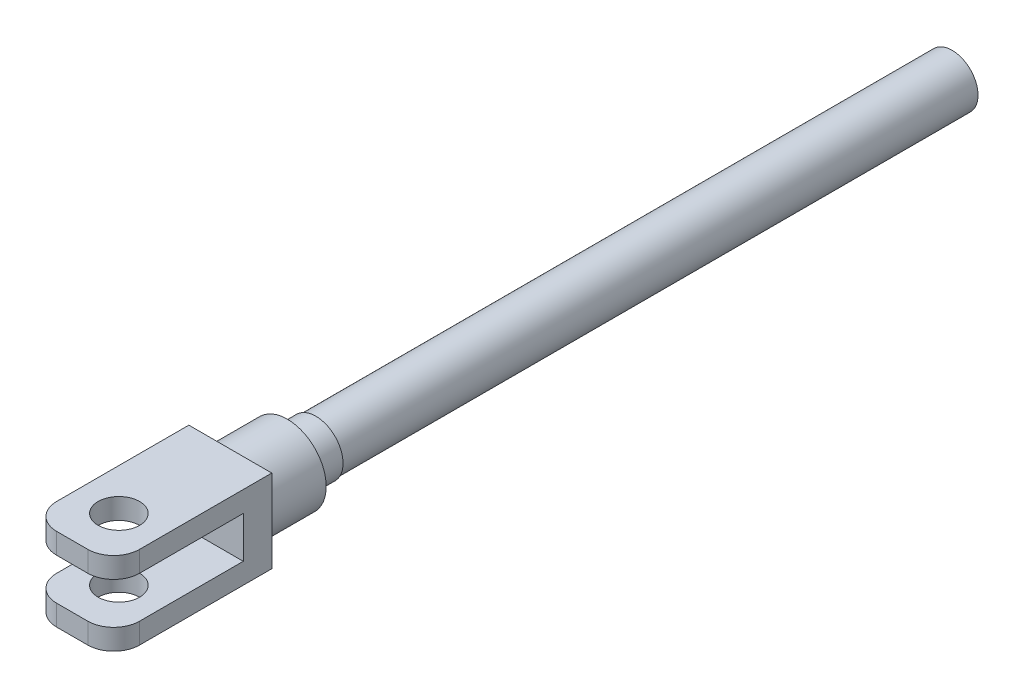
ISO-10303-21;
HEADER;
FILE_DESCRIPTION(('STEP AP214'),'2;1');
FILE_NAME('part.step','',(''),(''),'','','');
FILE_SCHEMA(('AUTOMOTIVE_DESIGN { 1 0 10303 214 1 1 1 1 }'));
ENDSEC;
DATA;
#1=APPLICATION_CONTEXT('core data for automotive mechanical design processes');
#2=APPLICATION_PROTOCOL_DEFINITION('international standard','automotive_design',2000,#1);
#3=PRODUCT_CONTEXT('',#1,'mechanical');
#4=PRODUCT('Part','Part','',(#3));
#5=PRODUCT_RELATED_PRODUCT_CATEGORY('part','',(#4));
#6=PRODUCT_DEFINITION_FORMATION('','',#4);
#7=PRODUCT_DEFINITION_CONTEXT('part definition',#1,'design');
#8=PRODUCT_DEFINITION('design','',#6,#7);
#9=PRODUCT_DEFINITION_SHAPE('','',#8);
#10=(LENGTH_UNIT() NAMED_UNIT(*) SI_UNIT(.MILLI.,.METRE.));
#11=(NAMED_UNIT(*) PLANE_ANGLE_UNIT() SI_UNIT($,.RADIAN.));
#12=(NAMED_UNIT(*) SI_UNIT($,.STERADIAN.) SOLID_ANGLE_UNIT());
#13=UNCERTAINTY_MEASURE_WITH_UNIT(LENGTH_MEASURE(1.E-05),#10,'distance_accuracy_value','');
#14=(GEOMETRIC_REPRESENTATION_CONTEXT(3) GLOBAL_UNCERTAINTY_ASSIGNED_CONTEXT((#13)) GLOBAL_UNIT_ASSIGNED_CONTEXT((#10,
#11,#12)) REPRESENTATION_CONTEXT('',''));
#15=CARTESIAN_POINT('',(0.,0.,0.));
#16=DIRECTION('',(0.,0.,1.));
#17=DIRECTION('',(1.,0.,0.));
#18=AXIS2_PLACEMENT_3D('',#15,#16,#17);
#19=CARTESIAN_POINT('',(0.,0.,339.53));
#20=DIRECTION('',(0.,0.,-1.));
#21=DIRECTION('',(-1.,0.,0.));
#22=AXIS2_PLACEMENT_3D('',#19,#20,#21);
#23=PLANE('',#22);
#24=DIRECTION('',(1.,0.,0.));
#25=VECTOR('',#24,1.);
#26=CARTESIAN_POINT('',(0.,8.,339.53));
#27=LINE('',#26,#25);
#28=CARTESIAN_POINT('',(-6.,8.,339.53));
#29=VERTEX_POINT('',#28);
#30=CARTESIAN_POINT('',(6.,8.,339.53));
#31=VERTEX_POINT('',#30);
#32=EDGE_CURVE('E201',#29,#31,#27,.T.);
#33=ORIENTED_EDGE('',*,*,#32,.T.);
#34=DIRECTION('',(0.,1.,0.));
#35=VECTOR('',#34,1.);
#36=CARTESIAN_POINT('',(6.,0.,339.53));
#37=LINE('',#36,#35);
#38=CARTESIAN_POINT('',(6.,16.,339.53));
#39=VERTEX_POINT('',#38);
#40=EDGE_CURVE('E230',#31,#39,#37,.T.);
#41=ORIENTED_EDGE('',*,*,#40,.T.);
#42=DIRECTION('',(-1.,0.,0.));
#43=VECTOR('',#42,1.);
#44=CARTESIAN_POINT('',(-16.,16.,339.53));
#45=LINE('',#44,#43);
#46=CARTESIAN_POINT('',(-6.,16.,339.53));
#47=VERTEX_POINT('',#46);
#48=EDGE_CURVE('E155',#39,#47,#45,.T.);
#49=ORIENTED_EDGE('',*,*,#48,.T.);
#50=DIRECTION('',(0.,-1.,0.));
#51=VECTOR('',#50,1.);
#52=CARTESIAN_POINT('',(-6.,0.,339.53));
#53=LINE('',#52,#51);
#54=EDGE_CURVE('E227',#47,#29,#53,.T.);
#55=ORIENTED_EDGE('',*,*,#54,.T.);
#56=EDGE_LOOP('',(#33,#41,#49,#55));
#57=FACE_BOUND('',#56,.T.);
#58=ADVANCED_FACE('F32',(#57),#23,.F.);
#59=CARTESIAN_POINT('',(0.,0.,245.53));
#60=DIRECTION('',(0.,0.,-1.));
#61=DIRECTION('',(-1.,0.,0.));
#62=AXIS2_PLACEMENT_3D('',#59,#60,#61);
#63=CYLINDRICAL_SURFACE('',#62,10.);
#64=CARTESIAN_POINT('',(0.,0.,245.53));
#65=DIRECTION('',(0.,0.,1.));
#66=DIRECTION('',(1.,0.,0.));
#67=AXIS2_PLACEMENT_3D('',#64,#65,#66);
#68=CIRCLE('',#67,10.);
#69=CARTESIAN_POINT('',(-10.,0.,245.53));
#70=VERTEX_POINT('',#69);
#71=EDGE_CURVE('E193',#70,#70,#68,.T.);
#72=CARTESIAN_POINT('',(0.,0.,0.));
#73=DIRECTION('',(0.,0.,1.));
#74=DIRECTION('',(1.,0.,0.));
#75=AXIS2_PLACEMENT_3D('',#72,#73,#74);
#76=CIRCLE('',#75,10.);
#77=CARTESIAN_POINT('',(-10.,0.,0.));
#78=VERTEX_POINT('',#77);
#79=EDGE_CURVE('E190',#78,#78,#76,.T.);
#80=CARTESIAN_POINT('',(-10.,0.,245.53));
#81=CARTESIAN_POINT('',(-10.,0.,242.972395833333));
#82=CARTESIAN_POINT('',(-10.,0.,240.414791666667));
#83=CARTESIAN_POINT('',(-10.,0.,235.299583333333));
#84=CARTESIAN_POINT('',(-10.,0.,232.741979166667));
#85=CARTESIAN_POINT('',(-10.,0.,227.626770833333));
#86=CARTESIAN_POINT('',(-10.,0.,225.069166666667));
#87=CARTESIAN_POINT('',(-10.,0.,219.953958333333));
#88=CARTESIAN_POINT('',(-10.,0.,217.396354166667));
#89=CARTESIAN_POINT('',(-10.,0.,212.281145833333));
#90=CARTESIAN_POINT('',(-10.,0.,209.723541666667));
#91=CARTESIAN_POINT('',(-10.,0.,204.608333333333));
#92=CARTESIAN_POINT('',(-10.,0.,202.050729166667));
#93=CARTESIAN_POINT('',(-10.,0.,196.935520833333));
#94=CARTESIAN_POINT('',(-10.,0.,194.377916666667));
#95=CARTESIAN_POINT('',(-10.,0.,189.262708333333));
#96=CARTESIAN_POINT('',(-10.,0.,186.705104166667));
#97=CARTESIAN_POINT('',(-10.,0.,181.589895833333));
#98=CARTESIAN_POINT('',(-10.,0.,179.032291666667));
#99=CARTESIAN_POINT('',(-10.,0.,173.917083333333));
#100=CARTESIAN_POINT('',(-10.,0.,171.359479166667));
#101=CARTESIAN_POINT('',(-10.,0.,166.244270833333));
#102=CARTESIAN_POINT('',(-10.,0.,163.686666666667));
#103=CARTESIAN_POINT('',(-10.,0.,158.571458333333));
#104=CARTESIAN_POINT('',(-10.,0.,156.013854166667));
#105=CARTESIAN_POINT('',(-10.,0.,150.898645833333));
#106=CARTESIAN_POINT('',(-10.,0.,148.341041666667));
#107=CARTESIAN_POINT('',(-10.,0.,143.225833333333));
#108=CARTESIAN_POINT('',(-10.,0.,140.668229166667));
#109=CARTESIAN_POINT('',(-10.,0.,135.553020833333));
#110=CARTESIAN_POINT('',(-10.,0.,132.995416666667));
#111=CARTESIAN_POINT('',(-10.,0.,127.880208333333));
#112=CARTESIAN_POINT('',(-10.,0.,125.322604166667));
#113=CARTESIAN_POINT('',(-10.,0.,120.207395833333));
#114=CARTESIAN_POINT('',(-10.,0.,117.649791666667));
#115=CARTESIAN_POINT('',(-10.,0.,112.534583333333));
#116=CARTESIAN_POINT('',(-10.,0.,109.976979166667));
#117=CARTESIAN_POINT('',(-10.,0.,104.861770833333));
#118=CARTESIAN_POINT('',(-10.,0.,102.304166666667));
#119=CARTESIAN_POINT('',(-10.,0.,97.1889583333333));
#120=CARTESIAN_POINT('',(-10.,0.,94.6313541666666));
#121=CARTESIAN_POINT('',(-10.,0.,89.5161458333333));
#122=CARTESIAN_POINT('',(-10.,0.,86.9585416666666));
#123=CARTESIAN_POINT('',(-10.,0.,81.8433333333333));
#124=CARTESIAN_POINT('',(-10.,0.,79.2857291666666));
#125=CARTESIAN_POINT('',(-10.,0.,74.1705208333333));
#126=CARTESIAN_POINT('',(-10.,0.,71.6129166666666));
#127=CARTESIAN_POINT('',(-10.,0.,66.4977083333333));
#128=CARTESIAN_POINT('',(-10.,0.,63.9401041666666));
#129=CARTESIAN_POINT('',(-10.,0.,58.8248958333333));
#130=CARTESIAN_POINT('',(-10.,0.,56.2672916666666));
#131=CARTESIAN_POINT('',(-10.,0.,51.1520833333333));
#132=CARTESIAN_POINT('',(-10.,0.,48.5944791666666));
#133=CARTESIAN_POINT('',(-10.,0.,43.4792708333333));
#134=CARTESIAN_POINT('',(-10.,0.,40.9216666666666));
#135=CARTESIAN_POINT('',(-10.,0.,35.8064583333333));
#136=CARTESIAN_POINT('',(-10.,0.,33.2488541666666));
#137=CARTESIAN_POINT('',(-10.,0.,28.1336458333333));
#138=CARTESIAN_POINT('',(-10.,0.,25.5760416666666));
#139=CARTESIAN_POINT('',(-10.,0.,20.4608333333333));
#140=CARTESIAN_POINT('',(-10.,0.,17.9032291666666));
#141=CARTESIAN_POINT('',(-10.,0.,12.7880208333333));
#142=CARTESIAN_POINT('',(-10.,0.,10.2304166666666));
#143=CARTESIAN_POINT('',(-10.,0.,5.1152083333333));
#144=CARTESIAN_POINT('',(-10.,0.,2.55760416666663));
#145=CARTESIAN_POINT('',(-10.,0.,0.));
#146=B_SPLINE_CURVE_WITH_KNOTS('',3,(#80,#81,#82,#83,#84,#85,#86,#87,#88,#89,#90,#91,#92,#93,
#94,#95,#96,#97,#98,#99,#100,#101,#102,#103,#104,#105,#106,#107,#108,#109,#110,#111,#112,#113,
#114,#115,#116,#117,#118,#119,#120,#121,#122,#123,#124,#125,#126,#127,#128,#129,#130,#131,#132,
#133,#134,#135,#136,#137,#138,#139,#140,#141,#142,#143,#144,#145),.UNSPECIFIED.,.F.,.F.,(4,2,2,
2,2,2,2,2,2,2,2,2,2,2,2,2,2,2,2,2,2,2,2,2,2,2,2,2,2,2,2,2,4),(0.,7.67281249999999,15.345625,
23.0184375,30.69125,38.3640625,46.036875,53.7096875,61.3825,69.0553125,76.7281249999999,
84.4009375,92.07375,99.7465625,107.419375,115.0921875,122.765,130.4378125,138.110625,
145.7834375,153.45625,161.1290625,168.801875,176.4746875,184.1475,191.8203125,199.493125,
207.1659375,214.83875,222.5115625,230.184375,237.8571875,245.53),.UNSPECIFIED.);
#147=EDGE_CURVE('BSEAM270',#70,#78,#146,.T.);
#148=ORIENTED_EDGE('',*,*,#71,.F.);
#149=ORIENTED_EDGE('',*,*,#79,.T.);
#150=ORIENTED_EDGE('',*,*,#147,.T.);
#151=ORIENTED_EDGE('',*,*,#147,.F.);
#152=EDGE_LOOP('',(#148,#150,#149,#151));
#153=FACE_BOUND('',#152,.T.);
#154=ADVANCED_FACE('F270',(#153),#63,.T.);
#155=CARTESIAN_POINT('',(0.,0.,0.));
#156=DIRECTION('',(0.,0.,1.));
#157=DIRECTION('',(1.,0.,0.));
#158=AXIS2_PLACEMENT_3D('',#155,#156,#157);
#159=PLANE('',#158);
#160=ORIENTED_EDGE('',*,*,#79,.F.);
#161=EDGE_LOOP('',(#160));
#162=FACE_BOUND('',#161,.T.);
#163=ADVANCED_FACE('F276',(#162),#159,.F.);
#164=CARTESIAN_POINT('',(0.,0.,256.53));
#165=DIRECTION('',(0.,0.,-1.));
#166=DIRECTION('',(-1.,0.,0.));
#167=AXIS2_PLACEMENT_3D('',#164,#165,#166);
#168=CYLINDRICAL_SURFACE('',#167,10.5);
#169=CARTESIAN_POINT('',(0.,0.,256.53));
#170=DIRECTION('',(0.,0.,1.));
#171=DIRECTION('',(1.,0.,0.));
#172=AXIS2_PLACEMENT_3D('',#169,#170,#171);
#173=CIRCLE('',#172,10.5);
#174=CARTESIAN_POINT('',(10.5,0.,256.53));
#175=VERTEX_POINT('',#174);
#176=EDGE_CURVE('E187',#175,#175,#173,.T.);
#177=ORIENTED_EDGE('',*,*,#176,.F.);
#178=EDGE_LOOP('',(#177));
#179=FACE_BOUND('',#178,.T.);
#180=CARTESIAN_POINT('',(0.,0.,245.53));
#181=DIRECTION('',(0.,0.,1.));
#182=DIRECTION('',(1.,0.,0.));
#183=AXIS2_PLACEMENT_3D('',#180,#181,#182);
#184=CIRCLE('',#183,10.5);
#185=CARTESIAN_POINT('',(10.5,0.,245.53));
#186=VERTEX_POINT('',#185);
#187=EDGE_CURVE('E184',#186,#186,#184,.T.);
#188=ORIENTED_EDGE('',*,*,#187,.T.);
#189=EDGE_LOOP('',(#188));
#190=FACE_BOUND('',#189,.T.);
#191=ADVANCED_FACE('F313',(#179,#190),#168,.T.);
#192=CARTESIAN_POINT('',(0.,0.,245.53));
#193=DIRECTION('',(0.,0.,1.));
#194=DIRECTION('',(1.,0.,0.));
#195=AXIS2_PLACEMENT_3D('',#192,#193,#194);
#196=PLANE('',#195);
#197=ORIENTED_EDGE('',*,*,#71,.T.);
#198=EDGE_LOOP('',(#197));
#199=FACE_BOUND('',#198,.T.);
#200=ORIENTED_EDGE('',*,*,#187,.F.);
#201=EDGE_LOOP('',(#200));
#202=FACE_BOUND('',#201,.T.);
#203=ADVANCED_FACE('F317',(#199,#202),#196,.F.);
#204=CARTESIAN_POINT('',(0.,0.,278.53));
#205=DIRECTION('',(0.,0.,-1.));
#206=DIRECTION('',(-1.,0.,0.));
#207=AXIS2_PLACEMENT_3D('',#204,#205,#206);
#208=CYLINDRICAL_SURFACE('',#207,15.);
#209=CARTESIAN_POINT('',(0.,0.,278.53));
#210=DIRECTION('',(0.,0.,1.));
#211=DIRECTION('',(1.,0.,0.));
#212=AXIS2_PLACEMENT_3D('',#209,#210,#211);
#213=CIRCLE('',#212,15.);
#214=CARTESIAN_POINT('',(15.,0.,278.53));
#215=VERTEX_POINT('',#214);
#216=EDGE_CURVE('E181',#215,#215,#213,.T.);
#217=ORIENTED_EDGE('',*,*,#216,.F.);
#218=EDGE_LOOP('',(#217));
#219=FACE_BOUND('',#218,.T.);
#220=CARTESIAN_POINT('',(0.,0.,256.53));
#221=DIRECTION('',(0.,0.,1.));
#222=DIRECTION('',(1.,0.,0.));
#223=AXIS2_PLACEMENT_3D('',#220,#221,#222);
#224=CIRCLE('',#223,15.);
#225=CARTESIAN_POINT('',(15.,0.,256.53));
#226=VERTEX_POINT('',#225);
#227=EDGE_CURVE('E180',#226,#226,#224,.T.);
#228=ORIENTED_EDGE('',*,*,#227,.T.);
#229=EDGE_LOOP('',(#228));
#230=FACE_BOUND('',#229,.T.);
#231=ADVANCED_FACE('F321',(#219,#230),#208,.T.);
#232=CARTESIAN_POINT('',(0.,0.,256.53));
#233=DIRECTION('',(0.,0.,1.));
#234=DIRECTION('',(1.,0.,0.));
#235=AXIS2_PLACEMENT_3D('',#232,#233,#234);
#236=PLANE('',#235);
#237=ORIENTED_EDGE('',*,*,#176,.T.);
#238=EDGE_LOOP('',(#237));
#239=FACE_BOUND('',#238,.T.);
#240=ORIENTED_EDGE('',*,*,#227,.F.);
#241=EDGE_LOOP('',(#240));
#242=FACE_BOUND('',#241,.T.);
#243=ADVANCED_FACE('F325',(#239,#242),#236,.F.);
#244=CARTESIAN_POINT('',(16.,-16.,339.53));
#245=DIRECTION('',(-1.,0.,0.));
#246=DIRECTION('',(0.,0.,1.));
#247=AXIS2_PLACEMENT_3D('',#244,#245,#246);
#248=PLANE('',#247);
#249=DIRECTION('',(0.,0.,1.));
#250=VECTOR('',#249,1.);
#251=CARTESIAN_POINT('',(16.,-8.,339.53));
#252=LINE('',#251,#250);
#253=CARTESIAN_POINT('',(16.,-8.,289.53));
#254=VERTEX_POINT('',#253);
#255=CARTESIAN_POINT('',(16.,-8.,329.53));
#256=VERTEX_POINT('',#255);
#257=EDGE_CURVE('E127',#254,#256,#252,.T.);
#258=ORIENTED_EDGE('',*,*,#257,.T.);
#259=DIRECTION('',(0.,1.,0.));
#260=VECTOR('',#259,1.);
#261=CARTESIAN_POINT('',(16.,-16.,329.53));
#262=LINE('',#261,#260);
#263=CARTESIAN_POINT('',(16.,-16.,329.53));
#264=VERTEX_POINT('',#263);
#265=EDGE_CURVE('E221',#256,#264,#262,.F.);
#266=ORIENTED_EDGE('',*,*,#265,.T.);
#267=DIRECTION('',(0.,0.,-1.));
#268=VECTOR('',#267,1.);
#269=CARTESIAN_POINT('',(16.,-16.,339.53));
#270=LINE('',#269,#268);
#271=CARTESIAN_POINT('',(16.,-16.,278.53));
#272=VERTEX_POINT('',#271);
#273=EDGE_CURVE('E162',#264,#272,#270,.T.);
#274=ORIENTED_EDGE('',*,*,#273,.T.);
#275=DIRECTION('',(0.,1.,0.));
#276=VECTOR('',#275,1.);
#277=CARTESIAN_POINT('',(16.,-16.,278.53));
#278=LINE('',#277,#276);
#279=CARTESIAN_POINT('',(16.,16.,278.53));
#280=VERTEX_POINT('',#279);
#281=EDGE_CURVE('E154',#272,#280,#278,.T.);
#282=ORIENTED_EDGE('',*,*,#281,.T.);
#283=DIRECTION('',(0.,0.,-1.));
#284=VECTOR('',#283,1.);
#285=CARTESIAN_POINT('',(16.,16.,339.53));
#286=LINE('',#285,#284);
#287=CARTESIAN_POINT('',(16.,16.,329.53));
#288=VERTEX_POINT('',#287);
#289=EDGE_CURVE('E178',#288,#280,#286,.T.);
#290=ORIENTED_EDGE('',*,*,#289,.F.);
#291=DIRECTION('',(0.,1.,0.));
#292=VECTOR('',#291,1.);
#293=CARTESIAN_POINT('',(16.,-16.,329.53));
#294=LINE('',#293,#292);
#295=CARTESIAN_POINT('',(16.,8.,329.53));
#296=VERTEX_POINT('',#295);
#297=EDGE_CURVE('E219',#288,#296,#294,.F.);
#298=ORIENTED_EDGE('',*,*,#297,.T.);
#299=DIRECTION('',(0.,0.,-1.));
#300=VECTOR('',#299,1.);
#301=CARTESIAN_POINT('',(16.,8.,339.53));
#302=LINE('',#301,#300);
#303=CARTESIAN_POINT('',(16.,7.99999999999997,289.53));
#304=VERTEX_POINT('',#303);
#305=EDGE_CURVE('E150',#296,#304,#302,.T.);
#306=ORIENTED_EDGE('',*,*,#305,.T.);
#307=DIRECTION('',(0.,-1.,0.));
#308=VECTOR('',#307,1.);
#309=CARTESIAN_POINT('',(16.,-16.,289.53));
#310=LINE('',#309,#308);
#311=EDGE_CURVE('E152',#304,#254,#310,.T.);
#312=ORIENTED_EDGE('',*,*,#311,.T.);
#313=EDGE_LOOP('',(#258,#266,#274,#282,#290,#298,#306,#312));
#314=FACE_BOUND('',#313,.T.);
#315=ADVANCED_FACE('F254',(#314),#248,.F.);
#316=CARTESIAN_POINT('',(-16.,16.,339.53));
#317=DIRECTION('',(0.,-1.,0.));
#318=DIRECTION('',(0.,0.,-1.));
#319=AXIS2_PLACEMENT_3D('',#316,#317,#318);
#320=PLANE('',#319);
#321=CARTESIAN_POINT('',(0.,16.,321.53));
#322=DIRECTION('',(0.,1.,0.));
#323=DIRECTION('',(0.,0.,1.));
#324=AXIS2_PLACEMENT_3D('',#321,#322,#323);
#325=CIRCLE('',#324,8.00000000000001);
#326=CARTESIAN_POINT('',(0.,16.,329.53));
#327=VERTEX_POINT('',#326);
#328=EDGE_CURVE('E209',#327,#327,#325,.T.);
#329=ORIENTED_EDGE('',*,*,#328,.F.);
#330=EDGE_LOOP('',(#329));
#331=FACE_BOUND('',#330,.T.);
#332=ORIENTED_EDGE('',*,*,#48,.F.);
#333=CARTESIAN_POINT('',(6.,16.,329.53));
#334=DIRECTION('',(0.,-1.,0.));
#335=DIRECTION('',(0.,0.,-1.));
#336=AXIS2_PLACEMENT_3D('',#333,#334,#335);
#337=CIRCLE('',#336,10.);
#338=EDGE_CURVE('E235',#39,#288,#337,.F.);
#339=ORIENTED_EDGE('',*,*,#338,.T.);
#340=ORIENTED_EDGE('',*,*,#289,.T.);
#341=DIRECTION('',(-1.,0.,0.));
#342=VECTOR('',#341,1.);
#343=CARTESIAN_POINT('',(-16.,16.,278.53));
#344=LINE('',#343,#342);
#345=CARTESIAN_POINT('',(-16.,16.,278.53));
#346=VERTEX_POINT('',#345);
#347=EDGE_CURVE('E165',#280,#346,#344,.T.);
#348=ORIENTED_EDGE('',*,*,#347,.T.);
#349=DIRECTION('',(0.,0.,-1.));
#350=VECTOR('',#349,1.);
#351=CARTESIAN_POINT('',(-16.,16.,339.53));
#352=LINE('',#351,#350);
#353=CARTESIAN_POINT('',(-16.,16.,329.53));
#354=VERTEX_POINT('',#353);
#355=EDGE_CURVE('E176',#354,#346,#352,.T.);
#356=ORIENTED_EDGE('',*,*,#355,.F.);
#357=CARTESIAN_POINT('',(-6.,16.,329.53));
#358=DIRECTION('',(0.,-1.,0.));
#359=DIRECTION('',(0.,0.,-1.));
#360=AXIS2_PLACEMENT_3D('',#357,#358,#359);
#361=CIRCLE('',#360,10.);
#362=EDGE_CURVE('E233',#354,#47,#361,.F.);
#363=ORIENTED_EDGE('',*,*,#362,.T.);
#364=EDGE_LOOP('',(#332,#339,#340,#348,#356,#363));
#365=FACE_BOUND('',#364,.T.);
#366=ADVANCED_FACE('F251',(#331,#365),#320,.F.);
#367=CARTESIAN_POINT('',(-16.,-16.,339.53));
#368=DIRECTION('',(1.,0.,0.));
#369=DIRECTION('',(0.,0.,-1.));
#370=AXIS2_PLACEMENT_3D('',#367,#368,#369);
#371=PLANE('',#370);
#372=DIRECTION('',(0.,0.,-1.));
#373=VECTOR('',#372,1.);
#374=CARTESIAN_POINT('',(-16.,-16.,339.53));
#375=LINE('',#374,#373);
#376=CARTESIAN_POINT('',(-16.,-16.,329.53));
#377=VERTEX_POINT('',#376);
#378=CARTESIAN_POINT('',(-16.,-16.,278.53));
#379=VERTEX_POINT('',#378);
#380=EDGE_CURVE('E174',#377,#379,#375,.T.);
#381=ORIENTED_EDGE('',*,*,#380,.F.);
#382=DIRECTION('',(0.,-1.,0.));
#383=VECTOR('',#382,1.);
#384=CARTESIAN_POINT('',(-16.,-16.,329.53));
#385=LINE('',#384,#383);
#386=CARTESIAN_POINT('',(-16.,-8.,329.53));
#387=VERTEX_POINT('',#386);
#388=EDGE_CURVE('E11',#377,#387,#385,.F.);
#389=ORIENTED_EDGE('',*,*,#388,.T.);
#390=DIRECTION('',(0.,0.,1.));
#391=VECTOR('',#390,1.);
#392=CARTESIAN_POINT('',(-16.,-8.,289.53));
#393=LINE('',#392,#391);
#394=CARTESIAN_POINT('',(-16.,-8.,289.53));
#395=VERTEX_POINT('',#394);
#396=EDGE_CURVE('E124',#395,#387,#393,.T.);
#397=ORIENTED_EDGE('',*,*,#396,.F.);
#398=DIRECTION('',(0.,-1.,0.));
#399=VECTOR('',#398,1.);
#400=CARTESIAN_POINT('',(-16.,7.99999999999997,289.53));
#401=LINE('',#400,#399);
#402=CARTESIAN_POINT('',(-16.,7.99999999999997,289.53));
#403=VERTEX_POINT('',#402);
#404=EDGE_CURVE('E136',#403,#395,#401,.T.);
#405=ORIENTED_EDGE('',*,*,#404,.F.);
#406=DIRECTION('',(0.,0.,-1.));
#407=VECTOR('',#406,1.);
#408=CARTESIAN_POINT('',(-16.,7.99999999999997,289.53));
#409=LINE('',#408,#407);
#410=CARTESIAN_POINT('',(-16.,7.99999999999999,329.53));
#411=VERTEX_POINT('',#410);
#412=EDGE_CURVE('E132',#411,#403,#409,.T.);
#413=ORIENTED_EDGE('',*,*,#412,.F.);
#414=DIRECTION('',(0.,-1.,0.));
#415=VECTOR('',#414,1.);
#416=CARTESIAN_POINT('',(-16.,-16.,329.53));
#417=LINE('',#416,#415);
#418=EDGE_CURVE('E40',#411,#354,#417,.F.);
#419=ORIENTED_EDGE('',*,*,#418,.T.);
#420=ORIENTED_EDGE('',*,*,#355,.T.);
#421=DIRECTION('',(0.,-1.,0.));
#422=VECTOR('',#421,1.);
#423=CARTESIAN_POINT('',(-16.,-16.,278.53));
#424=LINE('',#423,#422);
#425=EDGE_CURVE('E168',#346,#379,#424,.T.);
#426=ORIENTED_EDGE('',*,*,#425,.T.);
#427=EDGE_LOOP('',(#381,#389,#397,#405,#413,#419,#420,#426));
#428=FACE_BOUND('',#427,.T.);
#429=ADVANCED_FACE('F142',(#428),#371,.F.);
#430=CARTESIAN_POINT('',(-16.,-16.,339.53));
#431=DIRECTION('',(0.,1.,0.));
#432=DIRECTION('',(0.,0.,1.));
#433=AXIS2_PLACEMENT_3D('',#430,#431,#432);
#434=PLANE('',#433);
#435=CARTESIAN_POINT('',(0.,-16.,321.53));
#436=DIRECTION('',(0.,1.,0.));
#437=DIRECTION('',(0.,0.,1.));
#438=AXIS2_PLACEMENT_3D('',#435,#436,#437);
#439=CIRCLE('',#438,8.00000000000001);
#440=CARTESIAN_POINT('',(0.,-16.,329.53));
#441=VERTEX_POINT('',#440);
#442=EDGE_CURVE('E139',#441,#441,#439,.T.);
#443=ORIENTED_EDGE('',*,*,#442,.T.);
#444=EDGE_LOOP('',(#443));
#445=FACE_BOUND('',#444,.T.);
#446=ORIENTED_EDGE('',*,*,#273,.F.);
#447=CARTESIAN_POINT('',(6.,-16.,329.53));
#448=DIRECTION('',(0.,1.,0.));
#449=DIRECTION('',(0.,0.,1.));
#450=AXIS2_PLACEMENT_3D('',#447,#448,#449);
#451=CIRCLE('',#450,10.);
#452=CARTESIAN_POINT('',(6.,-16.,339.53));
#453=VERTEX_POINT('',#452);
#454=EDGE_CURVE('E225',#264,#453,#451,.F.);
#455=ORIENTED_EDGE('',*,*,#454,.T.);
#456=DIRECTION('',(1.,0.,0.));
#457=VECTOR('',#456,1.);
#458=CARTESIAN_POINT('',(-16.,-16.,339.53));
#459=LINE('',#458,#457);
#460=CARTESIAN_POINT('',(-6.,-16.,339.53));
#461=VERTEX_POINT('',#460);
#462=EDGE_CURVE('E158',#461,#453,#459,.T.);
#463=ORIENTED_EDGE('',*,*,#462,.F.);
#464=CARTESIAN_POINT('',(-6.,-16.,329.53));
#465=DIRECTION('',(0.,1.,0.));
#466=DIRECTION('',(0.,0.,1.));
#467=AXIS2_PLACEMENT_3D('',#464,#465,#466);
#468=CIRCLE('',#467,10.);
#469=EDGE_CURVE('E223',#461,#377,#468,.F.);
#470=ORIENTED_EDGE('',*,*,#469,.T.);
#471=ORIENTED_EDGE('',*,*,#380,.T.);
#472=DIRECTION('',(1.,0.,0.));
#473=VECTOR('',#472,1.);
#474=CARTESIAN_POINT('',(-16.,-16.,278.53));
#475=LINE('',#474,#473);
#476=EDGE_CURVE('E159',#379,#272,#475,.T.);
#477=ORIENTED_EDGE('',*,*,#476,.T.);
#478=EDGE_LOOP('',(#446,#455,#463,#470,#471,#477));
#479=FACE_BOUND('',#478,.T.);
#480=ADVANCED_FACE('F282',(#445,#479),#434,.F.);
#481=ORIENTED_EDGE('',*,*,#462,.T.);
#482=DIRECTION('',(0.,1.,0.));
#483=VECTOR('',#482,1.);
#484=CARTESIAN_POINT('',(6.,0.,339.53));
#485=LINE('',#484,#483);
#486=CARTESIAN_POINT('',(6.,-8.,339.53));
#487=VERTEX_POINT('',#486);
#488=EDGE_CURVE('E212',#453,#487,#485,.T.);
#489=ORIENTED_EDGE('',*,*,#488,.T.);
#490=DIRECTION('',(-1.,0.,0.));
#491=VECTOR('',#490,1.);
#492=CARTESIAN_POINT('',(0.,-8.,339.53));
#493=LINE('',#492,#491);
#494=CARTESIAN_POINT('',(-6.,-8.,339.53));
#495=VERTEX_POINT('',#494);
#496=EDGE_CURVE('E196',#487,#495,#493,.T.);
#497=ORIENTED_EDGE('',*,*,#496,.T.);
#498=DIRECTION('',(0.,-1.,0.));
#499=VECTOR('',#498,1.);
#500=CARTESIAN_POINT('',(-6.,0.,339.53));
#501=LINE('',#500,#499);
#502=EDGE_CURVE('E204',#495,#461,#501,.T.);
#503=ORIENTED_EDGE('',*,*,#502,.T.);
#504=EDGE_LOOP('',(#481,#489,#497,#503));
#505=FACE_BOUND('',#504,.T.);
#506=ADVANCED_FACE('F272',(#505),#23,.F.);
#507=CARTESIAN_POINT('',(0.,0.,278.53));
#508=DIRECTION('',(0.,0.,-1.));
#509=DIRECTION('',(-1.,0.,0.));
#510=AXIS2_PLACEMENT_3D('',#507,#508,#509);
#511=PLANE('',#510);
#512=ORIENTED_EDGE('',*,*,#216,.T.);
#513=EDGE_LOOP('',(#512));
#514=FACE_BOUND('',#513,.T.);
#515=ORIENTED_EDGE('',*,*,#281,.F.);
#516=ORIENTED_EDGE('',*,*,#476,.F.);
#517=ORIENTED_EDGE('',*,*,#425,.F.);
#518=ORIENTED_EDGE('',*,*,#347,.F.);
#519=EDGE_LOOP('',(#515,#516,#517,#518));
#520=FACE_BOUND('',#519,.T.);
#521=ADVANCED_FACE('F259',(#514,#520),#511,.T.);
#522=CARTESIAN_POINT('',(42.,7.99999999999997,289.53));
#523=DIRECTION('',(0.,0.,-1.));
#524=DIRECTION('',(-1.,0.,0.));
#525=AXIS2_PLACEMENT_3D('',#522,#523,#524);
#526=PLANE('',#525);
#527=DIRECTION('',(-1.,0.,0.));
#528=VECTOR('',#527,1.);
#529=CARTESIAN_POINT('',(42.,7.99999999999997,289.53));
#530=LINE('',#529,#528);
#531=EDGE_CURVE('E131',#304,#403,#530,.T.);
#532=ORIENTED_EDGE('',*,*,#531,.T.);
#533=ORIENTED_EDGE('',*,*,#404,.T.);
#534=DIRECTION('',(-1.,0.,0.));
#535=VECTOR('',#534,1.);
#536=CARTESIAN_POINT('',(42.,-8.,289.53));
#537=LINE('',#536,#535);
#538=EDGE_CURVE('E119',#254,#395,#537,.T.);
#539=ORIENTED_EDGE('',*,*,#538,.F.);
#540=ORIENTED_EDGE('',*,*,#311,.F.);
#541=EDGE_LOOP('',(#532,#533,#539,#540));
#542=FACE_BOUND('',#541,.T.);
#543=ADVANCED_FACE('F137',(#542),#526,.F.);
#544=CARTESIAN_POINT('',(42.,7.99999999999997,289.53));
#545=DIRECTION('',(0.,1.,0.));
#546=DIRECTION('',(0.,0.,1.));
#547=AXIS2_PLACEMENT_3D('',#544,#545,#546);
#548=PLANE('',#547);
#549=CARTESIAN_POINT('',(0.,7.99999999999999,321.53));
#550=DIRECTION('',(0.,1.,0.));
#551=DIRECTION('',(0.,0.,1.));
#552=AXIS2_PLACEMENT_3D('',#549,#550,#551);
#553=CIRCLE('',#552,8.00000000000001);
#554=CARTESIAN_POINT('',(0.,7.99999999999999,329.53));
#555=VERTEX_POINT('',#554);
#556=EDGE_CURVE('E208',#555,#555,#553,.T.);
#557=ORIENTED_EDGE('',*,*,#556,.T.);
#558=EDGE_LOOP('',(#557));
#559=FACE_BOUND('',#558,.T.);
#560=ORIENTED_EDGE('',*,*,#305,.F.);
#561=CARTESIAN_POINT('',(6.,7.99999999999999,329.53));
#562=DIRECTION('',(0.,1.,0.));
#563=DIRECTION('',(0.,0.,1.));
#564=AXIS2_PLACEMENT_3D('',#561,#562,#563);
#565=CIRCLE('',#564,10.);
#566=EDGE_CURVE('E238',#296,#31,#565,.F.);
#567=ORIENTED_EDGE('',*,*,#566,.T.);
#568=ORIENTED_EDGE('',*,*,#32,.F.);
#569=CARTESIAN_POINT('',(-6.,7.99999999999999,329.53));
#570=DIRECTION('',(0.,1.,0.));
#571=DIRECTION('',(0.,0.,1.));
#572=AXIS2_PLACEMENT_3D('',#569,#570,#571);
#573=CIRCLE('',#572,10.);
#574=EDGE_CURVE('E47',#29,#411,#573,.F.);
#575=ORIENTED_EDGE('',*,*,#574,.T.);
#576=ORIENTED_EDGE('',*,*,#412,.T.);
#577=ORIENTED_EDGE('',*,*,#531,.F.);
#578=EDGE_LOOP('',(#560,#567,#568,#575,#576,#577));
#579=FACE_BOUND('',#578,.T.);
#580=ADVANCED_FACE('F241',(#559,#579),#548,.F.);
#581=CARTESIAN_POINT('',(42.,-8.,289.53));
#582=DIRECTION('',(0.,-1.,0.));
#583=DIRECTION('',(0.,0.,-1.));
#584=AXIS2_PLACEMENT_3D('',#581,#582,#583);
#585=PLANE('',#584);
#586=CARTESIAN_POINT('',(0.,-8.00000000000001,321.53));
#587=DIRECTION('',(0.,-1.,0.));
#588=DIRECTION('',(0.,0.,-1.));
#589=AXIS2_PLACEMENT_3D('',#586,#587,#588);
#590=CIRCLE('',#589,8.00000000000001);
#591=CARTESIAN_POINT('',(0.,-8.00000000000001,329.53));
#592=VERTEX_POINT('',#591);
#593=EDGE_CURVE('E205',#592,#592,#590,.T.);
#594=ORIENTED_EDGE('',*,*,#593,.T.);
#595=EDGE_LOOP('',(#594));
#596=FACE_BOUND('',#595,.T.);
#597=ORIENTED_EDGE('',*,*,#496,.F.);
#598=CARTESIAN_POINT('',(6.,-8.,329.53));
#599=DIRECTION('',(0.,-1.,0.));
#600=DIRECTION('',(0.,0.,-1.));
#601=AXIS2_PLACEMENT_3D('',#598,#599,#600);
#602=CIRCLE('',#601,10.);
#603=EDGE_CURVE('E217',#487,#256,#602,.F.);
#604=ORIENTED_EDGE('',*,*,#603,.T.);
#605=ORIENTED_EDGE('',*,*,#257,.F.);
#606=ORIENTED_EDGE('',*,*,#538,.T.);
#607=ORIENTED_EDGE('',*,*,#396,.T.);
#608=CARTESIAN_POINT('',(-6.,-8.,329.53));
#609=DIRECTION('',(0.,-1.,0.));
#610=DIRECTION('',(0.,0.,-1.));
#611=AXIS2_PLACEMENT_3D('',#608,#609,#610);
#612=CIRCLE('',#611,10.);
#613=EDGE_CURVE('E215',#387,#495,#612,.F.);
#614=ORIENTED_EDGE('',*,*,#613,.T.);
#615=EDGE_LOOP('',(#597,#604,#605,#606,#607,#614));
#616=FACE_BOUND('',#615,.T.);
#617=ADVANCED_FACE('F122',(#596,#616),#585,.F.);
#618=CARTESIAN_POINT('',(0.,-42.,321.53));
#619=DIRECTION('',(0.,1.,0.));
#620=DIRECTION('',(0.,0.,1.));
#621=AXIS2_PLACEMENT_3D('',#618,#619,#620);
#622=CYLINDRICAL_SURFACE('',#621,8.00000000000001);
#623=CARTESIAN_POINT('',(0.,-8.00000000000001,329.53));
#624=CARTESIAN_POINT('',(0.,-8.08333333333334,329.53));
#625=CARTESIAN_POINT('',(0.,-8.16666666666667,329.53));
#626=CARTESIAN_POINT('',(0.,-8.33333333333334,329.53));
#627=CARTESIAN_POINT('',(0.,-8.41666666666667,329.53));
#628=CARTESIAN_POINT('',(0.,-8.58333333333334,329.53));
#629=CARTESIAN_POINT('',(0.,-8.66666666666667,329.53));
#630=CARTESIAN_POINT('',(0.,-8.83333333333334,329.53));
#631=CARTESIAN_POINT('',(0.,-8.91666666666667,329.53));
#632=CARTESIAN_POINT('',(0.,-9.08333333333334,329.53));
#633=CARTESIAN_POINT('',(0.,-9.16666666666667,329.53));
#634=CARTESIAN_POINT('',(0.,-9.33333333333334,329.53));
#635=CARTESIAN_POINT('',(0.,-9.41666666666667,329.53));
#636=CARTESIAN_POINT('',(0.,-9.58333333333334,329.53));
#637=CARTESIAN_POINT('',(0.,-9.66666666666667,329.53));
#638=CARTESIAN_POINT('',(0.,-9.83333333333334,329.53));
#639=CARTESIAN_POINT('',(0.,-9.91666666666668,329.53));
#640=CARTESIAN_POINT('',(0.,-10.0833333333333,329.53));
#641=CARTESIAN_POINT('',(0.,-10.1666666666667,329.53));
#642=CARTESIAN_POINT('',(0.,-10.3333333333333,329.53));
#643=CARTESIAN_POINT('',(0.,-10.4166666666667,329.53));
#644=CARTESIAN_POINT('',(0.,-10.5833333333333,329.53));
#645=CARTESIAN_POINT('',(0.,-10.6666666666667,329.53));
#646=CARTESIAN_POINT('',(0.,-10.8333333333333,329.53));
#647=CARTESIAN_POINT('',(0.,-10.9166666666667,329.53));
#648=CARTESIAN_POINT('',(0.,-11.0833333333333,329.53));
#649=CARTESIAN_POINT('',(0.,-11.1666666666667,329.53));
#650=CARTESIAN_POINT('',(0.,-11.3333333333333,329.53));
#651=CARTESIAN_POINT('',(0.,-11.4166666666667,329.53));
#652=CARTESIAN_POINT('',(0.,-11.5833333333333,329.53));
#653=CARTESIAN_POINT('',(0.,-11.6666666666667,329.53));
#654=CARTESIAN_POINT('',(0.,-11.8333333333333,329.53));
#655=CARTESIAN_POINT('',(0.,-11.9166666666667,329.53));
#656=CARTESIAN_POINT('',(0.,-12.0833333333333,329.53));
#657=CARTESIAN_POINT('',(0.,-12.1666666666667,329.53));
#658=CARTESIAN_POINT('',(0.,-12.3333333333333,329.53));
#659=CARTESIAN_POINT('',(0.,-12.4166666666667,329.53));
#660=CARTESIAN_POINT('',(0.,-12.5833333333333,329.53));
#661=CARTESIAN_POINT('',(0.,-12.6666666666667,329.53));
#662=CARTESIAN_POINT('',(0.,-12.8333333333333,329.53));
#663=CARTESIAN_POINT('',(0.,-12.9166666666667,329.53));
#664=CARTESIAN_POINT('',(0.,-13.0833333333333,329.53));
#665=CARTESIAN_POINT('',(0.,-13.1666666666667,329.53));
#666=CARTESIAN_POINT('',(0.,-13.3333333333333,329.53));
#667=CARTESIAN_POINT('',(0.,-13.4166666666667,329.53));
#668=CARTESIAN_POINT('',(0.,-13.5833333333333,329.53));
#669=CARTESIAN_POINT('',(0.,-13.6666666666667,329.53));
#670=CARTESIAN_POINT('',(0.,-13.8333333333333,329.53));
#671=CARTESIAN_POINT('',(0.,-13.9166666666667,329.53));
#672=CARTESIAN_POINT('',(0.,-14.0833333333333,329.53));
#673=CARTESIAN_POINT('',(0.,-14.1666666666667,329.53));
#674=CARTESIAN_POINT('',(0.,-14.3333333333333,329.53));
#675=CARTESIAN_POINT('',(0.,-14.4166666666667,329.53));
#676=CARTESIAN_POINT('',(0.,-14.5833333333333,329.53));
#677=CARTESIAN_POINT('',(0.,-14.6666666666667,329.53));
#678=CARTESIAN_POINT('',(0.,-14.8333333333333,329.53));
#679=CARTESIAN_POINT('',(0.,-14.9166666666667,329.53));
#680=CARTESIAN_POINT('',(0.,-15.0833333333333,329.53));
#681=CARTESIAN_POINT('',(0.,-15.1666666666667,329.53));
#682=CARTESIAN_POINT('',(0.,-15.3333333333333,329.53));
#683=CARTESIAN_POINT('',(0.,-15.4166666666667,329.53));
#684=CARTESIAN_POINT('',(0.,-15.5833333333333,329.53));
#685=CARTESIAN_POINT('',(0.,-15.6666666666667,329.53));
#686=CARTESIAN_POINT('',(0.,-15.8333333333333,329.53));
#687=CARTESIAN_POINT('',(0.,-15.9166666666667,329.53));
#688=CARTESIAN_POINT('',(0.,-16.,329.53));
#689=B_SPLINE_CURVE_WITH_KNOTS('',3,(#623,#624,#625,#626,#627,#628,#629,#630,#631,#632,#633,
#634,#635,#636,#637,#638,#639,#640,#641,#642,#643,#644,#645,#646,#647,#648,#649,#650,#651,#652,
#653,#654,#655,#656,#657,#658,#659,#660,#661,#662,#663,#664,#665,#666,#667,#668,#669,#670,#671,
#672,#673,#674,#675,#676,#677,#678,#679,#680,#681,#682,#683,#684,#685,#686,#687,#688),
.UNSPECIFIED.,.F.,.F.,(4,2,2,2,2,2,2,2,2,2,2,2,2,2,2,2,2,2,2,2,2,2,2,2,2,2,2,2,2,2,2,2,4),(0.,
0.25,0.5,0.750000000000001,1.,1.25,1.5,1.75,2.,2.25,2.5,2.75,3.,3.25,3.5,3.75,4.,4.25,4.5,4.75,
5.,5.25,5.49999999999999,5.74999999999999,5.99999999999999,6.25,6.5,6.75,7.,7.25,7.5,7.75,8.),.UNSPECIFIED.);
#690=EDGE_CURVE('BSEAM307',#592,#441,#689,.T.);
#691=ORIENTED_EDGE('',*,*,#593,.F.);
#692=ORIENTED_EDGE('',*,*,#442,.F.);
#693=ORIENTED_EDGE('',*,*,#690,.T.);
#694=ORIENTED_EDGE('',*,*,#690,.F.);
#695=EDGE_LOOP('',(#691,#693,#692,#694));
#696=FACE_BOUND('',#695,.T.);
#697=ADVANCED_FACE('F307',(#696),#622,.F.);
#698=CARTESIAN_POINT('',(0.,16.,329.53));
#699=CARTESIAN_POINT('',(0.,15.9166666666667,329.53));
#700=CARTESIAN_POINT('',(0.,15.8333333333333,329.53));
#701=CARTESIAN_POINT('',(0.,15.6666666666667,329.53));
#702=CARTESIAN_POINT('',(0.,15.5833333333333,329.53));
#703=CARTESIAN_POINT('',(0.,15.4166666666667,329.53));
#704=CARTESIAN_POINT('',(0.,15.3333333333333,329.53));
#705=CARTESIAN_POINT('',(0.,15.1666666666667,329.53));
#706=CARTESIAN_POINT('',(0.,15.0833333333333,329.53));
#707=CARTESIAN_POINT('',(0.,14.9166666666667,329.53));
#708=CARTESIAN_POINT('',(0.,14.8333333333333,329.53));
#709=CARTESIAN_POINT('',(0.,14.6666666666667,329.53));
#710=CARTESIAN_POINT('',(0.,14.5833333333333,329.53));
#711=CARTESIAN_POINT('',(0.,14.4166666666667,329.53));
#712=CARTESIAN_POINT('',(0.,14.3333333333333,329.53));
#713=CARTESIAN_POINT('',(0.,14.1666666666667,329.53));
#714=CARTESIAN_POINT('',(0.,14.0833333333333,329.53));
#715=CARTESIAN_POINT('',(0.,13.9166666666667,329.53));
#716=CARTESIAN_POINT('',(0.,13.8333333333333,329.53));
#717=CARTESIAN_POINT('',(0.,13.6666666666667,329.53));
#718=CARTESIAN_POINT('',(0.,13.5833333333333,329.53));
#719=CARTESIAN_POINT('',(0.,13.4166666666667,329.53));
#720=CARTESIAN_POINT('',(0.,13.3333333333333,329.53));
#721=CARTESIAN_POINT('',(0.,13.1666666666667,329.53));
#722=CARTESIAN_POINT('',(0.,13.0833333333333,329.53));
#723=CARTESIAN_POINT('',(0.,12.9166666666667,329.53));
#724=CARTESIAN_POINT('',(0.,12.8333333333333,329.53));
#725=CARTESIAN_POINT('',(0.,12.6666666666667,329.53));
#726=CARTESIAN_POINT('',(0.,12.5833333333333,329.53));
#727=CARTESIAN_POINT('',(0.,12.4166666666667,329.53));
#728=CARTESIAN_POINT('',(0.,12.3333333333333,329.53));
#729=CARTESIAN_POINT('',(0.,12.1666666666667,329.53));
#730=CARTESIAN_POINT('',(0.,12.0833333333333,329.53));
#731=CARTESIAN_POINT('',(0.,11.9166666666667,329.53));
#732=CARTESIAN_POINT('',(0.,11.8333333333333,329.53));
#733=CARTESIAN_POINT('',(0.,11.6666666666667,329.53));
#734=CARTESIAN_POINT('',(0.,11.5833333333333,329.53));
#735=CARTESIAN_POINT('',(0.,11.4166666666667,329.53));
#736=CARTESIAN_POINT('',(0.,11.3333333333333,329.53));
#737=CARTESIAN_POINT('',(0.,11.1666666666667,329.53));
#738=CARTESIAN_POINT('',(0.,11.0833333333333,329.53));
#739=CARTESIAN_POINT('',(0.,10.9166666666667,329.53));
#740=CARTESIAN_POINT('',(0.,10.8333333333333,329.53));
#741=CARTESIAN_POINT('',(0.,10.6666666666667,329.53));
#742=CARTESIAN_POINT('',(0.,10.5833333333333,329.53));
#743=CARTESIAN_POINT('',(0.,10.4166666666667,329.53));
#744=CARTESIAN_POINT('',(0.,10.3333333333333,329.53));
#745=CARTESIAN_POINT('',(0.,10.1666666666667,329.53));
#746=CARTESIAN_POINT('',(0.,10.0833333333333,329.53));
#747=CARTESIAN_POINT('',(0.,9.91666666666666,329.53));
#748=CARTESIAN_POINT('',(0.,9.83333333333333,329.53));
#749=CARTESIAN_POINT('',(0.,9.66666666666666,329.53));
#750=CARTESIAN_POINT('',(0.,9.58333333333333,329.53));
#751=CARTESIAN_POINT('',(0.,9.41666666666666,329.53));
#752=CARTESIAN_POINT('',(0.,9.33333333333333,329.53));
#753=CARTESIAN_POINT('',(0.,9.16666666666666,329.53));
#754=CARTESIAN_POINT('',(0.,9.08333333333333,329.53));
#755=CARTESIAN_POINT('',(0.,8.91666666666666,329.53));
#756=CARTESIAN_POINT('',(0.,8.83333333333333,329.53));
#757=CARTESIAN_POINT('',(0.,8.66666666666666,329.53));
#758=CARTESIAN_POINT('',(0.,8.58333333333333,329.53));
#759=CARTESIAN_POINT('',(0.,8.41666666666666,329.53));
#760=CARTESIAN_POINT('',(0.,8.33333333333333,329.53));
#761=CARTESIAN_POINT('',(0.,8.16666666666666,329.53));
#762=CARTESIAN_POINT('',(0.,8.08333333333333,329.53));
#763=CARTESIAN_POINT('',(0.,7.99999999999999,329.53));
#764=B_SPLINE_CURVE_WITH_KNOTS('',3,(#698,#699,#700,#701,#702,#703,#704,#705,#706,#707,#708,
#709,#710,#711,#712,#713,#714,#715,#716,#717,#718,#719,#720,#721,#722,#723,#724,#725,#726,#727,
#728,#729,#730,#731,#732,#733,#734,#735,#736,#737,#738,#739,#740,#741,#742,#743,#744,#745,#746,
#747,#748,#749,#750,#751,#752,#753,#754,#755,#756,#757,#758,#759,#760,#761,#762,#763),
.UNSPECIFIED.,.F.,.F.,(4,2,2,2,2,2,2,2,2,2,2,2,2,2,2,2,2,2,2,2,2,2,2,2,2,2,2,2,2,2,2,2,4),(0.,
0.25,0.5,0.750000000000001,1.,1.25,1.5,1.75,2.,2.25,2.5,2.75,3.,3.25,3.5,3.75,4.,4.25,4.5,4.75,
5.,5.25,5.50000000000001,5.75000000000001,6.00000000000001,6.25000000000001,6.50000000000001,
6.75000000000001,7.00000000000001,7.25000000000001,7.50000000000001,7.75000000000001,
8.00000000000001),.UNSPECIFIED.);
#765=EDGE_CURVE('BSEAM300',#327,#555,#764,.T.);
#766=ORIENTED_EDGE('',*,*,#328,.T.);
#767=ORIENTED_EDGE('',*,*,#556,.F.);
#768=ORIENTED_EDGE('',*,*,#765,.T.);
#769=ORIENTED_EDGE('',*,*,#765,.F.);
#770=EDGE_LOOP('',(#766,#768,#767,#769));
#771=FACE_BOUND('',#770,.T.);
#772=ADVANCED_FACE('F300',(#771),#622,.F.);
#773=CARTESIAN_POINT('',(6.,0.,329.53));
#774=DIRECTION('',(0.,1.,0.));
#775=DIRECTION('',(0.,0.,1.));
#776=AXIS2_PLACEMENT_3D('',#773,#774,#775);
#777=CYLINDRICAL_SURFACE('',#776,10.);
#778=ORIENTED_EDGE('',*,*,#454,.F.);
#779=ORIENTED_EDGE('',*,*,#265,.F.);
#780=ORIENTED_EDGE('',*,*,#603,.F.);
#781=ORIENTED_EDGE('',*,*,#488,.F.);
#782=EDGE_LOOP('',(#778,#779,#780,#781));
#783=FACE_BOUND('',#782,.T.);
#784=ADVANCED_FACE('F297',(#783),#777,.T.);
#785=CARTESIAN_POINT('',(6.,0.,329.53));
#786=DIRECTION('',(0.,1.,0.));
#787=DIRECTION('',(0.,0.,1.));
#788=AXIS2_PLACEMENT_3D('',#785,#786,#787);
#789=CYLINDRICAL_SURFACE('',#788,10.);
#790=ORIENTED_EDGE('',*,*,#566,.F.);
#791=ORIENTED_EDGE('',*,*,#297,.F.);
#792=ORIENTED_EDGE('',*,*,#338,.F.);
#793=ORIENTED_EDGE('',*,*,#40,.F.);
#794=EDGE_LOOP('',(#790,#791,#792,#793));
#795=FACE_BOUND('',#794,.T.);
#796=ADVANCED_FACE('F248',(#795),#789,.T.);
#797=CARTESIAN_POINT('',(-6.,0.,329.53));
#798=DIRECTION('',(0.,-1.,0.));
#799=DIRECTION('',(0.,0.,-1.));
#800=AXIS2_PLACEMENT_3D('',#797,#798,#799);
#801=CYLINDRICAL_SURFACE('',#800,10.);
#802=ORIENTED_EDGE('',*,*,#613,.F.);
#803=ORIENTED_EDGE('',*,*,#388,.F.);
#804=ORIENTED_EDGE('',*,*,#469,.F.);
#805=ORIENTED_EDGE('',*,*,#502,.F.);
#806=EDGE_LOOP('',(#802,#803,#804,#805));
#807=FACE_BOUND('',#806,.T.);
#808=ADVANCED_FACE('F264',(#807),#801,.T.);
#809=CARTESIAN_POINT('',(-6.,0.,329.53));
#810=DIRECTION('',(0.,-1.,0.));
#811=DIRECTION('',(0.,0.,-1.));
#812=AXIS2_PLACEMENT_3D('',#809,#810,#811);
#813=CYLINDRICAL_SURFACE('',#812,10.);
#814=ORIENTED_EDGE('',*,*,#362,.F.);
#815=ORIENTED_EDGE('',*,*,#418,.F.);
#816=ORIENTED_EDGE('',*,*,#574,.F.);
#817=ORIENTED_EDGE('',*,*,#54,.F.);
#818=EDGE_LOOP('',(#814,#815,#816,#817));
#819=FACE_BOUND('',#818,.T.);
#820=ADVANCED_FACE('F34',(#819),#813,.T.);
#821=CLOSED_SHELL('',(#58,#154,#163,#191,#203,#231,#243,#315,#366,#429,#480,#506,#521,#543,#580,
#617,#697,#772,#784,#796,#808,#820));
#822=MANIFOLD_SOLID_BREP('B2',#821);
#823=ADVANCED_BREP_SHAPE_REPRESENTATION('',(#18,#822),#14);
#824=SHAPE_DEFINITION_REPRESENTATION(#9,#823);
ENDSEC;
END-ISO-10303-21;
